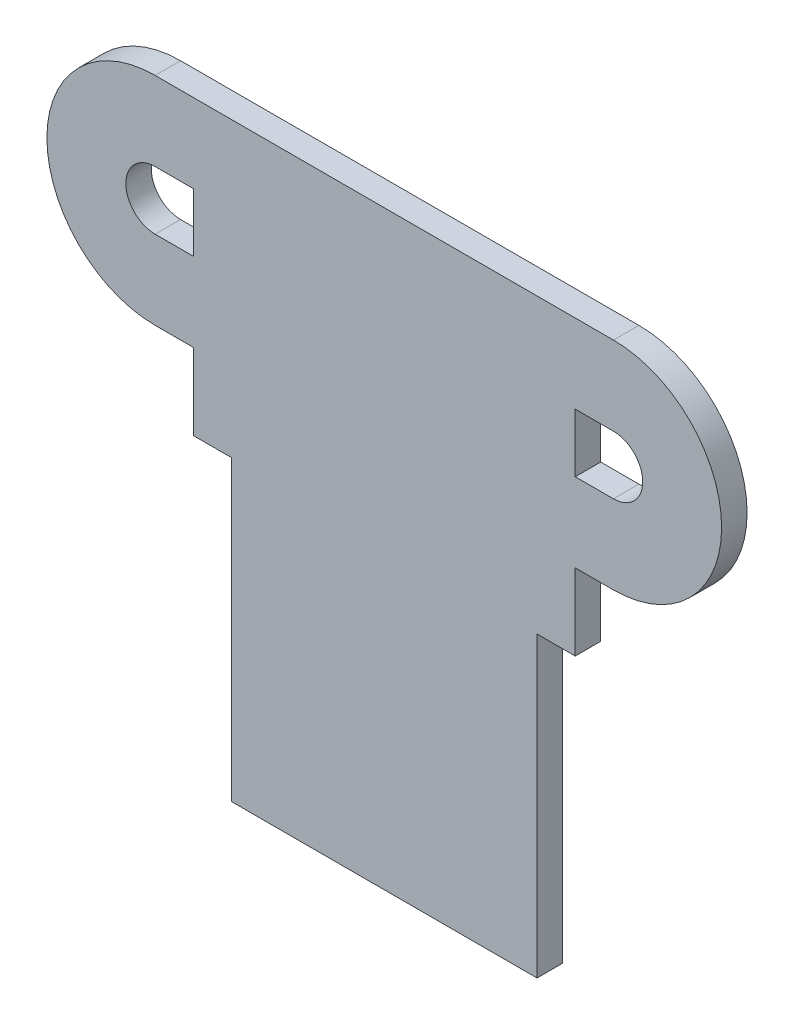
ISO-10303-21;
HEADER;
FILE_DESCRIPTION(('STEP AP214'),'2;1');
FILE_NAME('part.step','',(''),(''),'','','');
FILE_SCHEMA(('AUTOMOTIVE_DESIGN { 1 0 10303 214 1 1 1 1 }'));
ENDSEC;
DATA;
#1=APPLICATION_CONTEXT('core data for automotive mechanical design processes');
#2=APPLICATION_PROTOCOL_DEFINITION('international standard','automotive_design',2000,#1);
#3=PRODUCT_CONTEXT('',#1,'mechanical');
#4=PRODUCT('Part','Part','',(#3));
#5=PRODUCT_RELATED_PRODUCT_CATEGORY('part','',(#4));
#6=PRODUCT_DEFINITION_FORMATION('','',#4);
#7=PRODUCT_DEFINITION_CONTEXT('part definition',#1,'design');
#8=PRODUCT_DEFINITION('design','',#6,#7);
#9=PRODUCT_DEFINITION_SHAPE('','',#8);
#10=(LENGTH_UNIT() NAMED_UNIT(*) SI_UNIT(.MILLI.,.METRE.));
#11=(NAMED_UNIT(*) PLANE_ANGLE_UNIT() SI_UNIT($,.RADIAN.));
#12=(NAMED_UNIT(*) SI_UNIT($,.STERADIAN.) SOLID_ANGLE_UNIT());
#13=UNCERTAINTY_MEASURE_WITH_UNIT(LENGTH_MEASURE(1.E-05),#10,'distance_accuracy_value','');
#14=(GEOMETRIC_REPRESENTATION_CONTEXT(3) GLOBAL_UNCERTAINTY_ASSIGNED_CONTEXT((#13)) GLOBAL_UNIT_ASSIGNED_CONTEXT((#10,
#11,#12)) REPRESENTATION_CONTEXT('',''));
#15=CARTESIAN_POINT('',(0.,0.,0.));
#16=DIRECTION('',(0.,0.,1.));
#17=DIRECTION('',(1.,0.,0.));
#18=AXIS2_PLACEMENT_3D('',#15,#16,#17);
#19=CARTESIAN_POINT('',(-3.,18.95,1.));
#20=DIRECTION('',(0.,0.,1.));
#21=DIRECTION('',(1.,0.,0.));
#22=AXIS2_PLACEMENT_3D('',#19,#20,#21);
#23=PLANE('',#22);
#24=DIRECTION('',(-1.,0.,0.));
#25=VECTOR('',#24,1.);
#26=CARTESIAN_POINT('',(15.,20.1,1.));
#27=LINE('',#26,#25);
#28=CARTESIAN_POINT('',(15.,20.1,1.));
#29=VERTEX_POINT('',#28);
#30=CARTESIAN_POINT('',(13.5,20.1,1.));
#31=VERTEX_POINT('',#30);
#32=EDGE_CURVE('E206',#29,#31,#27,.T.);
#33=ORIENTED_EDGE('',*,*,#32,.F.);
#34=CARTESIAN_POINT('',(15.,18.95,1.));
#35=DIRECTION('',(0.,0.,1.));
#36=DIRECTION('',(-1.,0.,0.));
#37=AXIS2_PLACEMENT_3D('',#34,#35,#36);
#38=CIRCLE('',#37,1.15);
#39=CARTESIAN_POINT('',(15.,17.8,1.));
#40=VERTEX_POINT('',#39);
#41=EDGE_CURVE('E204',#40,#29,#38,.T.);
#42=ORIENTED_EDGE('',*,*,#41,.F.);
#43=DIRECTION('',(1.,0.,0.));
#44=VECTOR('',#43,1.);
#45=CARTESIAN_POINT('',(13.5,17.8,1.));
#46=LINE('',#45,#44);
#47=CARTESIAN_POINT('',(13.5,17.8,1.));
#48=VERTEX_POINT('',#47);
#49=EDGE_CURVE('E212',#48,#40,#46,.T.);
#50=ORIENTED_EDGE('',*,*,#49,.F.);
#51=DIRECTION('',(0.,-1.,0.));
#52=VECTOR('',#51,1.);
#53=CARTESIAN_POINT('',(13.5,20.1,1.));
#54=LINE('',#53,#52);
#55=EDGE_CURVE('E209',#31,#48,#54,.T.);
#56=ORIENTED_EDGE('',*,*,#55,.F.);
#57=EDGE_LOOP('',(#33,#42,#50,#56));
#58=FACE_BOUND('',#57,.T.);
#59=DIRECTION('',(0.,-1.,0.));
#60=VECTOR('',#59,1.);
#61=CARTESIAN_POINT('',(0.,0.,1.));
#62=LINE('',#61,#60);
#63=CARTESIAN_POINT('',(0.,11.7,1.));
#64=VERTEX_POINT('',#63);
#65=CARTESIAN_POINT('',(0.,0.,1.));
#66=VERTEX_POINT('',#65);
#67=EDGE_CURVE('E235',#64,#66,#62,.T.);
#68=ORIENTED_EDGE('',*,*,#67,.T.);
#69=DIRECTION('',(1.,0.,0.));
#70=VECTOR('',#69,1.);
#71=CARTESIAN_POINT('',(0.,0.,1.));
#72=LINE('',#71,#70);
#73=CARTESIAN_POINT('',(12.,0.,1.));
#74=VERTEX_POINT('',#73);
#75=EDGE_CURVE('E238',#66,#74,#72,.T.);
#76=ORIENTED_EDGE('',*,*,#75,.T.);
#77=DIRECTION('',(0.,1.,0.));
#78=VECTOR('',#77,1.);
#79=CARTESIAN_POINT('',(12.,0.,1.));
#80=LINE('',#79,#78);
#81=CARTESIAN_POINT('',(12.,11.7,1.));
#82=VERTEX_POINT('',#81);
#83=EDGE_CURVE('E241',#74,#82,#80,.T.);
#84=ORIENTED_EDGE('',*,*,#83,.T.);
#85=DIRECTION('',(1.,0.,0.));
#86=VECTOR('',#85,1.);
#87=CARTESIAN_POINT('',(12.,11.7,1.));
#88=LINE('',#87,#86);
#89=CARTESIAN_POINT('',(13.5,11.7,1.));
#90=VERTEX_POINT('',#89);
#91=EDGE_CURVE('E243',#82,#90,#88,.T.);
#92=ORIENTED_EDGE('',*,*,#91,.T.);
#93=DIRECTION('',(0.,1.,0.));
#94=VECTOR('',#93,1.);
#95=CARTESIAN_POINT('',(13.5,11.7,1.));
#96=LINE('',#95,#94);
#97=CARTESIAN_POINT('',(13.5,14.7,1.));
#98=VERTEX_POINT('',#97);
#99=EDGE_CURVE('E245',#90,#98,#96,.T.);
#100=ORIENTED_EDGE('',*,*,#99,.T.);
#101=DIRECTION('',(1.,0.,0.));
#102=VECTOR('',#101,1.);
#103=CARTESIAN_POINT('',(13.5,14.7,1.));
#104=LINE('',#103,#102);
#105=CARTESIAN_POINT('',(15.,14.7,1.));
#106=VERTEX_POINT('',#105);
#107=EDGE_CURVE('E247',#98,#106,#104,.T.);
#108=ORIENTED_EDGE('',*,*,#107,.T.);
#109=CARTESIAN_POINT('',(15.,18.95,1.));
#110=DIRECTION('',(0.,0.,1.));
#111=DIRECTION('',(-1.,0.,0.));
#112=AXIS2_PLACEMENT_3D('',#109,#110,#111);
#113=CIRCLE('',#112,4.25);
#114=CARTESIAN_POINT('',(15.,23.2,1.));
#115=VERTEX_POINT('',#114);
#116=EDGE_CURVE('E249',#106,#115,#113,.T.);
#117=ORIENTED_EDGE('',*,*,#116,.T.);
#118=DIRECTION('',(-1.,0.,0.));
#119=VECTOR('',#118,1.);
#120=CARTESIAN_POINT('',(-3.,23.2,1.));
#121=LINE('',#120,#119);
#122=CARTESIAN_POINT('',(-3.,23.2,1.));
#123=VERTEX_POINT('',#122);
#124=EDGE_CURVE('E251',#115,#123,#121,.T.);
#125=ORIENTED_EDGE('',*,*,#124,.T.);
#126=CARTESIAN_POINT('',(-3.,18.95,1.));
#127=DIRECTION('',(0.,0.,1.));
#128=DIRECTION('',(1.,0.,0.));
#129=AXIS2_PLACEMENT_3D('',#126,#127,#128);
#130=CIRCLE('',#129,4.25);
#131=CARTESIAN_POINT('',(-3.,14.7,1.));
#132=VERTEX_POINT('',#131);
#133=EDGE_CURVE('E253',#123,#132,#130,.T.);
#134=ORIENTED_EDGE('',*,*,#133,.T.);
#135=DIRECTION('',(1.,0.,0.));
#136=VECTOR('',#135,1.);
#137=CARTESIAN_POINT('',(-3.,14.7,1.));
#138=LINE('',#137,#136);
#139=CARTESIAN_POINT('',(-1.5,14.7,1.));
#140=VERTEX_POINT('',#139);
#141=EDGE_CURVE('E255',#132,#140,#138,.T.);
#142=ORIENTED_EDGE('',*,*,#141,.T.);
#143=DIRECTION('',(0.,-1.,0.));
#144=VECTOR('',#143,1.);
#145=CARTESIAN_POINT('',(-1.5,14.7,1.));
#146=LINE('',#145,#144);
#147=CARTESIAN_POINT('',(-1.5,11.7,1.));
#148=VERTEX_POINT('',#147);
#149=EDGE_CURVE('E257',#140,#148,#146,.T.);
#150=ORIENTED_EDGE('',*,*,#149,.T.);
#151=DIRECTION('',(1.,0.,0.));
#152=VECTOR('',#151,1.);
#153=CARTESIAN_POINT('',(-1.5,11.7,1.));
#154=LINE('',#153,#152);
#155=EDGE_CURVE('E259',#148,#64,#154,.T.);
#156=ORIENTED_EDGE('',*,*,#155,.T.);
#157=EDGE_LOOP('',(#68,#76,#84,#92,#100,#108,#117,#125,#134,#142,#150,#156));
#158=FACE_BOUND('',#157,.T.);
#159=DIRECTION('',(1.,0.,0.));
#160=VECTOR('',#159,1.);
#161=CARTESIAN_POINT('',(-1.5,17.8,1.));
#162=LINE('',#161,#160);
#163=CARTESIAN_POINT('',(-3.,17.8,1.));
#164=VERTEX_POINT('',#163);
#165=CARTESIAN_POINT('',(-1.5,17.8,1.));
#166=VERTEX_POINT('',#165);
#167=EDGE_CURVE('E176',#164,#166,#162,.T.);
#168=ORIENTED_EDGE('',*,*,#167,.F.);
#169=CARTESIAN_POINT('',(-3.,18.95,1.));
#170=DIRECTION('',(0.,0.,1.));
#171=DIRECTION('',(1.,0.,0.));
#172=AXIS2_PLACEMENT_3D('',#169,#170,#171);
#173=CIRCLE('',#172,1.15);
#174=CARTESIAN_POINT('',(-3.,20.1,1.));
#175=VERTEX_POINT('',#174);
#176=EDGE_CURVE('E168',#175,#164,#173,.T.);
#177=ORIENTED_EDGE('',*,*,#176,.F.);
#178=DIRECTION('',(-1.,0.,0.));
#179=VECTOR('',#178,1.);
#180=CARTESIAN_POINT('',(-3.,20.1,1.));
#181=LINE('',#180,#179);
#182=CARTESIAN_POINT('',(-1.5,20.1,1.));
#183=VERTEX_POINT('',#182);
#184=EDGE_CURVE('E190',#183,#175,#181,.T.);
#185=ORIENTED_EDGE('',*,*,#184,.F.);
#186=DIRECTION('',(0.,1.,0.));
#187=VECTOR('',#186,1.);
#188=CARTESIAN_POINT('',(-1.5,20.1,1.));
#189=LINE('',#188,#187);
#190=EDGE_CURVE('E188',#166,#183,#189,.T.);
#191=ORIENTED_EDGE('',*,*,#190,.F.);
#192=EDGE_LOOP('',(#168,#177,#185,#191));
#193=FACE_BOUND('',#192,.T.);
#194=ADVANCED_FACE('F31',(#58,#158,#193),#23,.T.);
#195=CARTESIAN_POINT('',(-3.,18.95,0.));
#196=DIRECTION('',(0.,0.,1.));
#197=DIRECTION('',(1.,0.,0.));
#198=AXIS2_PLACEMENT_3D('',#195,#196,#197);
#199=PLANE('',#198);
#200=CARTESIAN_POINT('',(15.,18.95,0.));
#201=DIRECTION('',(0.,0.,1.));
#202=DIRECTION('',(-1.,0.,0.));
#203=AXIS2_PLACEMENT_3D('',#200,#201,#202);
#204=CIRCLE('',#203,1.15);
#205=CARTESIAN_POINT('',(15.,17.8,0.));
#206=VERTEX_POINT('',#205);
#207=CARTESIAN_POINT('',(15.,20.1,0.));
#208=VERTEX_POINT('',#207);
#209=EDGE_CURVE('E184',#206,#208,#204,.T.);
#210=ORIENTED_EDGE('',*,*,#209,.T.);
#211=DIRECTION('',(-1.,0.,0.));
#212=VECTOR('',#211,1.);
#213=CARTESIAN_POINT('',(15.,20.1,0.));
#214=LINE('',#213,#212);
#215=CARTESIAN_POINT('',(13.5,20.1,0.));
#216=VERTEX_POINT('',#215);
#217=EDGE_CURVE('E217',#208,#216,#214,.T.);
#218=ORIENTED_EDGE('',*,*,#217,.T.);
#219=DIRECTION('',(0.,-1.,0.));
#220=VECTOR('',#219,1.);
#221=CARTESIAN_POINT('',(13.5,20.1,0.));
#222=LINE('',#221,#220);
#223=CARTESIAN_POINT('',(13.5,17.8,0.));
#224=VERTEX_POINT('',#223);
#225=EDGE_CURVE('E220',#216,#224,#222,.T.);
#226=ORIENTED_EDGE('',*,*,#225,.T.);
#227=DIRECTION('',(1.,0.,0.));
#228=VECTOR('',#227,1.);
#229=CARTESIAN_POINT('',(13.5,17.8,0.));
#230=LINE('',#229,#228);
#231=EDGE_CURVE('E207',#224,#206,#230,.T.);
#232=ORIENTED_EDGE('',*,*,#231,.T.);
#233=EDGE_LOOP('',(#210,#218,#226,#232));
#234=FACE_BOUND('',#233,.T.);
#235=DIRECTION('',(0.,-1.,0.));
#236=VECTOR('',#235,1.);
#237=CARTESIAN_POINT('',(0.,0.,0.));
#238=LINE('',#237,#236);
#239=CARTESIAN_POINT('',(0.,11.7,0.));
#240=VERTEX_POINT('',#239);
#241=CARTESIAN_POINT('',(0.,0.,0.));
#242=VERTEX_POINT('',#241);
#243=EDGE_CURVE('E234',#240,#242,#238,.T.);
#244=ORIENTED_EDGE('',*,*,#243,.F.);
#245=DIRECTION('',(1.,0.,0.));
#246=VECTOR('',#245,1.);
#247=CARTESIAN_POINT('',(-1.5,11.7,0.));
#248=LINE('',#247,#246);
#249=CARTESIAN_POINT('',(-1.5,11.7,0.));
#250=VERTEX_POINT('',#249);
#251=EDGE_CURVE('E239',#250,#240,#248,.T.);
#252=ORIENTED_EDGE('',*,*,#251,.F.);
#253=DIRECTION('',(0.,-1.,0.));
#254=VECTOR('',#253,1.);
#255=CARTESIAN_POINT('',(-1.5,14.7,0.));
#256=LINE('',#255,#254);
#257=CARTESIAN_POINT('',(-1.5,14.7,0.));
#258=VERTEX_POINT('',#257);
#259=EDGE_CURVE('E282',#258,#250,#256,.T.);
#260=ORIENTED_EDGE('',*,*,#259,.F.);
#261=DIRECTION('',(1.,0.,0.));
#262=VECTOR('',#261,1.);
#263=CARTESIAN_POINT('',(-3.,14.7,0.));
#264=LINE('',#263,#262);
#265=CARTESIAN_POINT('',(-3.,14.7,0.));
#266=VERTEX_POINT('',#265);
#267=EDGE_CURVE('E280',#266,#258,#264,.T.);
#268=ORIENTED_EDGE('',*,*,#267,.F.);
#269=CARTESIAN_POINT('',(-3.,18.95,0.));
#270=DIRECTION('',(0.,0.,1.));
#271=DIRECTION('',(1.,0.,0.));
#272=AXIS2_PLACEMENT_3D('',#269,#270,#271);
#273=CIRCLE('',#272,4.25);
#274=CARTESIAN_POINT('',(-3.,23.2,0.));
#275=VERTEX_POINT('',#274);
#276=EDGE_CURVE('E278',#275,#266,#273,.T.);
#277=ORIENTED_EDGE('',*,*,#276,.F.);
#278=DIRECTION('',(-1.,0.,0.));
#279=VECTOR('',#278,1.);
#280=CARTESIAN_POINT('',(-3.,23.2,0.));
#281=LINE('',#280,#279);
#282=CARTESIAN_POINT('',(15.,23.2,0.));
#283=VERTEX_POINT('',#282);
#284=EDGE_CURVE('E276',#283,#275,#281,.T.);
#285=ORIENTED_EDGE('',*,*,#284,.F.);
#286=CARTESIAN_POINT('',(15.,18.95,0.));
#287=DIRECTION('',(0.,0.,1.));
#288=DIRECTION('',(-1.,0.,0.));
#289=AXIS2_PLACEMENT_3D('',#286,#287,#288);
#290=CIRCLE('',#289,4.25);
#291=CARTESIAN_POINT('',(15.,14.7,0.));
#292=VERTEX_POINT('',#291);
#293=EDGE_CURVE('E274',#292,#283,#290,.T.);
#294=ORIENTED_EDGE('',*,*,#293,.F.);
#295=DIRECTION('',(1.,0.,0.));
#296=VECTOR('',#295,1.);
#297=CARTESIAN_POINT('',(13.5,14.7,0.));
#298=LINE('',#297,#296);
#299=CARTESIAN_POINT('',(13.5,14.7,0.));
#300=VERTEX_POINT('',#299);
#301=EDGE_CURVE('E272',#300,#292,#298,.T.);
#302=ORIENTED_EDGE('',*,*,#301,.F.);
#303=DIRECTION('',(0.,1.,0.));
#304=VECTOR('',#303,1.);
#305=CARTESIAN_POINT('',(13.5,11.7,0.));
#306=LINE('',#305,#304);
#307=CARTESIAN_POINT('',(13.5,11.7,0.));
#308=VERTEX_POINT('',#307);
#309=EDGE_CURVE('E270',#308,#300,#306,.T.);
#310=ORIENTED_EDGE('',*,*,#309,.F.);
#311=DIRECTION('',(1.,0.,0.));
#312=VECTOR('',#311,1.);
#313=CARTESIAN_POINT('',(12.,11.7,0.));
#314=LINE('',#313,#312);
#315=CARTESIAN_POINT('',(12.,11.7,0.));
#316=VERTEX_POINT('',#315);
#317=EDGE_CURVE('E268',#316,#308,#314,.T.);
#318=ORIENTED_EDGE('',*,*,#317,.F.);
#319=DIRECTION('',(0.,1.,0.));
#320=VECTOR('',#319,1.);
#321=CARTESIAN_POINT('',(12.,0.,0.));
#322=LINE('',#321,#320);
#323=CARTESIAN_POINT('',(12.,0.,0.));
#324=VERTEX_POINT('',#323);
#325=EDGE_CURVE('E266',#324,#316,#322,.T.);
#326=ORIENTED_EDGE('',*,*,#325,.F.);
#327=DIRECTION('',(1.,0.,0.));
#328=VECTOR('',#327,1.);
#329=CARTESIAN_POINT('',(0.,0.,0.));
#330=LINE('',#329,#328);
#331=EDGE_CURVE('E264',#242,#324,#330,.T.);
#332=ORIENTED_EDGE('',*,*,#331,.F.);
#333=EDGE_LOOP('',(#244,#252,#260,#268,#277,#285,#294,#302,#310,#318,#326,#332));
#334=FACE_BOUND('',#333,.T.);
#335=CARTESIAN_POINT('',(-3.,18.95,0.));
#336=DIRECTION('',(0.,0.,1.));
#337=DIRECTION('',(1.,0.,0.));
#338=AXIS2_PLACEMENT_3D('',#335,#336,#337);
#339=CIRCLE('',#338,1.15);
#340=CARTESIAN_POINT('',(-3.,20.1,0.));
#341=VERTEX_POINT('',#340);
#342=CARTESIAN_POINT('',(-3.,17.8,0.));
#343=VERTEX_POINT('',#342);
#344=EDGE_CURVE('E54',#341,#343,#339,.T.);
#345=ORIENTED_EDGE('',*,*,#344,.T.);
#346=DIRECTION('',(1.,0.,0.));
#347=VECTOR('',#346,1.);
#348=CARTESIAN_POINT('',(-1.5,17.8,0.));
#349=LINE('',#348,#347);
#350=CARTESIAN_POINT('',(-1.5,17.8,0.));
#351=VERTEX_POINT('',#350);
#352=EDGE_CURVE('E183',#343,#351,#349,.T.);
#353=ORIENTED_EDGE('',*,*,#352,.T.);
#354=DIRECTION('',(0.,1.,0.));
#355=VECTOR('',#354,1.);
#356=CARTESIAN_POINT('',(-1.5,20.1,0.));
#357=LINE('',#356,#355);
#358=CARTESIAN_POINT('',(-1.5,20.1,0.));
#359=VERTEX_POINT('',#358);
#360=EDGE_CURVE('E196',#351,#359,#357,.T.);
#361=ORIENTED_EDGE('',*,*,#360,.T.);
#362=DIRECTION('',(-1.,0.,0.));
#363=VECTOR('',#362,1.);
#364=CARTESIAN_POINT('',(-3.,20.1,0.));
#365=LINE('',#364,#363);
#366=EDGE_CURVE('E177',#359,#341,#365,.T.);
#367=ORIENTED_EDGE('',*,*,#366,.T.);
#368=EDGE_LOOP('',(#345,#353,#361,#367));
#369=FACE_BOUND('',#368,.T.);
#370=ADVANCED_FACE('F324',(#234,#334,#369),#199,.F.);
#371=CARTESIAN_POINT('',(0.,0.,1.));
#372=DIRECTION('',(1.,0.,0.));
#373=DIRECTION('',(0.,0.,-1.));
#374=AXIS2_PLACEMENT_3D('',#371,#372,#373);
#375=PLANE('',#374);
#376=ORIENTED_EDGE('',*,*,#243,.T.);
#377=DIRECTION('',(0.,0.,-1.));
#378=VECTOR('',#377,1.);
#379=CARTESIAN_POINT('',(0.,0.,1.));
#380=LINE('',#379,#378);
#381=EDGE_CURVE('E11',#66,#242,#380,.T.);
#382=ORIENTED_EDGE('',*,*,#381,.F.);
#383=ORIENTED_EDGE('',*,*,#67,.F.);
#384=DIRECTION('',(0.,0.,-1.));
#385=VECTOR('',#384,1.);
#386=CARTESIAN_POINT('',(0.,11.7,1.));
#387=LINE('',#386,#385);
#388=EDGE_CURVE('E261',#64,#240,#387,.T.);
#389=ORIENTED_EDGE('',*,*,#388,.T.);
#390=EDGE_LOOP('',(#376,#382,#383,#389));
#391=FACE_BOUND('',#390,.T.);
#392=ADVANCED_FACE('F33',(#391),#375,.F.);
#393=CARTESIAN_POINT('',(0.,0.,1.));
#394=DIRECTION('',(0.,1.,0.));
#395=DIRECTION('',(0.,0.,1.));
#396=AXIS2_PLACEMENT_3D('',#393,#394,#395);
#397=PLANE('',#396);
#398=ORIENTED_EDGE('',*,*,#331,.T.);
#399=DIRECTION('',(0.,0.,-1.));
#400=VECTOR('',#399,1.);
#401=CARTESIAN_POINT('',(12.,0.,1.));
#402=LINE('',#401,#400);
#403=EDGE_CURVE('E39',#74,#324,#402,.T.);
#404=ORIENTED_EDGE('',*,*,#403,.F.);
#405=ORIENTED_EDGE('',*,*,#75,.F.);
#406=ORIENTED_EDGE('',*,*,#381,.T.);
#407=EDGE_LOOP('',(#398,#404,#405,#406));
#408=FACE_BOUND('',#407,.T.);
#409=ADVANCED_FACE('F341',(#408),#397,.F.);
#410=CARTESIAN_POINT('',(12.,0.,1.));
#411=DIRECTION('',(-1.,0.,0.));
#412=DIRECTION('',(0.,0.,1.));
#413=AXIS2_PLACEMENT_3D('',#410,#411,#412);
#414=PLANE('',#413);
#415=ORIENTED_EDGE('',*,*,#325,.T.);
#416=DIRECTION('',(0.,0.,-1.));
#417=VECTOR('',#416,1.);
#418=CARTESIAN_POINT('',(12.,11.7,1.));
#419=LINE('',#418,#417);
#420=EDGE_CURVE('E311',#82,#316,#419,.T.);
#421=ORIENTED_EDGE('',*,*,#420,.F.);
#422=ORIENTED_EDGE('',*,*,#83,.F.);
#423=ORIENTED_EDGE('',*,*,#403,.T.);
#424=EDGE_LOOP('',(#415,#421,#422,#423));
#425=FACE_BOUND('',#424,.T.);
#426=ADVANCED_FACE('F318',(#425),#414,.F.);
#427=CARTESIAN_POINT('',(12.,11.7,1.));
#428=DIRECTION('',(0.,1.,0.));
#429=DIRECTION('',(0.,0.,1.));
#430=AXIS2_PLACEMENT_3D('',#427,#428,#429);
#431=PLANE('',#430);
#432=ORIENTED_EDGE('',*,*,#317,.T.);
#433=DIRECTION('',(0.,0.,-1.));
#434=VECTOR('',#433,1.);
#435=CARTESIAN_POINT('',(13.5,11.7,1.));
#436=LINE('',#435,#434);
#437=EDGE_CURVE('E308',#90,#308,#436,.T.);
#438=ORIENTED_EDGE('',*,*,#437,.F.);
#439=ORIENTED_EDGE('',*,*,#91,.F.);
#440=ORIENTED_EDGE('',*,*,#420,.T.);
#441=EDGE_LOOP('',(#432,#438,#439,#440));
#442=FACE_BOUND('',#441,.T.);
#443=ADVANCED_FACE('F330',(#442),#431,.F.);
#444=CARTESIAN_POINT('',(13.5,11.7,1.));
#445=DIRECTION('',(-1.,0.,0.));
#446=DIRECTION('',(0.,-1.,0.));
#447=AXIS2_PLACEMENT_3D('',#444,#445,#446);
#448=PLANE('',#447);
#449=ORIENTED_EDGE('',*,*,#309,.T.);
#450=DIRECTION('',(0.,0.,-1.));
#451=VECTOR('',#450,1.);
#452=CARTESIAN_POINT('',(13.5,14.7,1.));
#453=LINE('',#452,#451);
#454=EDGE_CURVE('E305',#98,#300,#453,.T.);
#455=ORIENTED_EDGE('',*,*,#454,.F.);
#456=ORIENTED_EDGE('',*,*,#99,.F.);
#457=ORIENTED_EDGE('',*,*,#437,.T.);
#458=EDGE_LOOP('',(#449,#455,#456,#457));
#459=FACE_BOUND('',#458,.T.);
#460=ADVANCED_FACE('F334',(#459),#448,.F.);
#461=CARTESIAN_POINT('',(13.5,14.7,1.));
#462=DIRECTION('',(0.,1.,0.));
#463=DIRECTION('',(0.,0.,1.));
#464=AXIS2_PLACEMENT_3D('',#461,#462,#463);
#465=PLANE('',#464);
#466=ORIENTED_EDGE('',*,*,#301,.T.);
#467=DIRECTION('',(0.,0.,-1.));
#468=VECTOR('',#467,1.);
#469=CARTESIAN_POINT('',(15.,14.7,1.));
#470=LINE('',#469,#468);
#471=EDGE_CURVE('E302',#106,#292,#470,.T.);
#472=ORIENTED_EDGE('',*,*,#471,.F.);
#473=ORIENTED_EDGE('',*,*,#107,.F.);
#474=ORIENTED_EDGE('',*,*,#454,.T.);
#475=EDGE_LOOP('',(#466,#472,#473,#474));
#476=FACE_BOUND('',#475,.T.);
#477=ADVANCED_FACE('F374',(#476),#465,.F.);
#478=CARTESIAN_POINT('',(15.,18.95,1.));
#479=DIRECTION('',(0.,0.,-1.));
#480=DIRECTION('',(-1.,0.,0.));
#481=AXIS2_PLACEMENT_3D('',#478,#479,#480);
#482=CYLINDRICAL_SURFACE('',#481,4.25);
#483=ORIENTED_EDGE('',*,*,#293,.T.);
#484=DIRECTION('',(0.,0.,-1.));
#485=VECTOR('',#484,1.);
#486=CARTESIAN_POINT('',(15.,23.2,1.));
#487=LINE('',#486,#485);
#488=EDGE_CURVE('E299',#115,#283,#487,.T.);
#489=ORIENTED_EDGE('',*,*,#488,.F.);
#490=ORIENTED_EDGE('',*,*,#116,.F.);
#491=ORIENTED_EDGE('',*,*,#471,.T.);
#492=EDGE_LOOP('',(#483,#489,#490,#491));
#493=FACE_BOUND('',#492,.T.);
#494=ADVANCED_FACE('F372',(#493),#482,.T.);
#495=CARTESIAN_POINT('',(-3.,23.2,1.));
#496=DIRECTION('',(0.,-1.,0.));
#497=DIRECTION('',(0.,0.,-1.));
#498=AXIS2_PLACEMENT_3D('',#495,#496,#497);
#499=PLANE('',#498);
#500=ORIENTED_EDGE('',*,*,#284,.T.);
#501=DIRECTION('',(0.,0.,-1.));
#502=VECTOR('',#501,1.);
#503=CARTESIAN_POINT('',(-3.,23.2,1.));
#504=LINE('',#503,#502);
#505=EDGE_CURVE('E296',#123,#275,#504,.T.);
#506=ORIENTED_EDGE('',*,*,#505,.F.);
#507=ORIENTED_EDGE('',*,*,#124,.F.);
#508=ORIENTED_EDGE('',*,*,#488,.T.);
#509=EDGE_LOOP('',(#500,#506,#507,#508));
#510=FACE_BOUND('',#509,.T.);
#511=ADVANCED_FACE('F368',(#510),#499,.F.);
#512=CARTESIAN_POINT('',(-3.,18.95,1.));
#513=DIRECTION('',(0.,0.,-1.));
#514=DIRECTION('',(-1.,0.,0.));
#515=AXIS2_PLACEMENT_3D('',#512,#513,#514);
#516=CYLINDRICAL_SURFACE('',#515,4.25);
#517=ORIENTED_EDGE('',*,*,#276,.T.);
#518=DIRECTION('',(0.,0.,-1.));
#519=VECTOR('',#518,1.);
#520=CARTESIAN_POINT('',(-3.,14.7,1.));
#521=LINE('',#520,#519);
#522=EDGE_CURVE('E293',#132,#266,#521,.T.);
#523=ORIENTED_EDGE('',*,*,#522,.F.);
#524=ORIENTED_EDGE('',*,*,#133,.F.);
#525=ORIENTED_EDGE('',*,*,#505,.T.);
#526=EDGE_LOOP('',(#517,#523,#524,#525));
#527=FACE_BOUND('',#526,.T.);
#528=ADVANCED_FACE('F363',(#527),#516,.T.);
#529=CARTESIAN_POINT('',(-3.,14.7,1.));
#530=DIRECTION('',(0.,1.,0.));
#531=DIRECTION('',(0.,0.,1.));
#532=AXIS2_PLACEMENT_3D('',#529,#530,#531);
#533=PLANE('',#532);
#534=ORIENTED_EDGE('',*,*,#267,.T.);
#535=DIRECTION('',(0.,0.,-1.));
#536=VECTOR('',#535,1.);
#537=CARTESIAN_POINT('',(-1.5,14.7,1.));
#538=LINE('',#537,#536);
#539=EDGE_CURVE('E290',#140,#258,#538,.T.);
#540=ORIENTED_EDGE('',*,*,#539,.F.);
#541=ORIENTED_EDGE('',*,*,#141,.F.);
#542=ORIENTED_EDGE('',*,*,#522,.T.);
#543=EDGE_LOOP('',(#534,#540,#541,#542));
#544=FACE_BOUND('',#543,.T.);
#545=ADVANCED_FACE('F357',(#544),#533,.F.);
#546=CARTESIAN_POINT('',(-1.5,14.7,1.));
#547=DIRECTION('',(1.,0.,0.));
#548=DIRECTION('',(0.,0.,-1.));
#549=AXIS2_PLACEMENT_3D('',#546,#547,#548);
#550=PLANE('',#549);
#551=ORIENTED_EDGE('',*,*,#259,.T.);
#552=DIRECTION('',(0.,0.,-1.));
#553=VECTOR('',#552,1.);
#554=CARTESIAN_POINT('',(-1.5,11.7,1.));
#555=LINE('',#554,#553);
#556=EDGE_CURVE('E287',#148,#250,#555,.T.);
#557=ORIENTED_EDGE('',*,*,#556,.F.);
#558=ORIENTED_EDGE('',*,*,#149,.F.);
#559=ORIENTED_EDGE('',*,*,#539,.T.);
#560=EDGE_LOOP('',(#551,#557,#558,#559));
#561=FACE_BOUND('',#560,.T.);
#562=ADVANCED_FACE('F353',(#561),#550,.F.);
#563=CARTESIAN_POINT('',(-1.5,11.7,1.));
#564=DIRECTION('',(0.,1.,0.));
#565=DIRECTION('',(0.,0.,1.));
#566=AXIS2_PLACEMENT_3D('',#563,#564,#565);
#567=PLANE('',#566);
#568=ORIENTED_EDGE('',*,*,#251,.T.);
#569=ORIENTED_EDGE('',*,*,#388,.F.);
#570=ORIENTED_EDGE('',*,*,#155,.F.);
#571=ORIENTED_EDGE('',*,*,#556,.T.);
#572=EDGE_LOOP('',(#568,#569,#570,#571));
#573=FACE_BOUND('',#572,.T.);
#574=ADVANCED_FACE('F348',(#573),#567,.F.);
#575=CARTESIAN_POINT('',(15.,18.95,1.));
#576=DIRECTION('',(0.,0.,-1.));
#577=DIRECTION('',(-1.,0.,0.));
#578=AXIS2_PLACEMENT_3D('',#575,#576,#577);
#579=CYLINDRICAL_SURFACE('',#578,1.15);
#580=ORIENTED_EDGE('',*,*,#209,.F.);
#581=DIRECTION('',(0.,0.,-1.));
#582=VECTOR('',#581,1.);
#583=CARTESIAN_POINT('',(15.,17.8,1.));
#584=LINE('',#583,#582);
#585=EDGE_CURVE('E214',#40,#206,#584,.T.);
#586=ORIENTED_EDGE('',*,*,#585,.F.);
#587=ORIENTED_EDGE('',*,*,#41,.T.);
#588=DIRECTION('',(0.,0.,-1.));
#589=VECTOR('',#588,1.);
#590=CARTESIAN_POINT('',(15.,20.1,1.));
#591=LINE('',#590,#589);
#592=EDGE_CURVE('E231',#29,#208,#591,.T.);
#593=ORIENTED_EDGE('',*,*,#592,.T.);
#594=EDGE_LOOP('',(#580,#586,#587,#593));
#595=FACE_BOUND('',#594,.T.);
#596=ADVANCED_FACE('F393',(#595),#579,.F.);
#597=CARTESIAN_POINT('',(15.,20.1,1.));
#598=DIRECTION('',(0.,-1.,0.));
#599=DIRECTION('',(0.,0.,-1.));
#600=AXIS2_PLACEMENT_3D('',#597,#598,#599);
#601=PLANE('',#600);
#602=ORIENTED_EDGE('',*,*,#217,.F.);
#603=ORIENTED_EDGE('',*,*,#592,.F.);
#604=ORIENTED_EDGE('',*,*,#32,.T.);
#605=DIRECTION('',(0.,0.,-1.));
#606=VECTOR('',#605,1.);
#607=CARTESIAN_POINT('',(13.5,20.1,1.));
#608=LINE('',#607,#606);
#609=EDGE_CURVE('E229',#31,#216,#608,.T.);
#610=ORIENTED_EDGE('',*,*,#609,.T.);
#611=EDGE_LOOP('',(#602,#603,#604,#610));
#612=FACE_BOUND('',#611,.T.);
#613=ADVANCED_FACE('F431',(#612),#601,.T.);
#614=CARTESIAN_POINT('',(13.5,20.1,1.));
#615=DIRECTION('',(1.,0.,0.));
#616=DIRECTION('',(0.,0.,-1.));
#617=AXIS2_PLACEMENT_3D('',#614,#615,#616);
#618=PLANE('',#617);
#619=ORIENTED_EDGE('',*,*,#225,.F.);
#620=ORIENTED_EDGE('',*,*,#609,.F.);
#621=ORIENTED_EDGE('',*,*,#55,.T.);
#622=DIRECTION('',(0.,0.,-1.));
#623=VECTOR('',#622,1.);
#624=CARTESIAN_POINT('',(13.5,17.8,1.));
#625=LINE('',#624,#623);
#626=EDGE_CURVE('E227',#48,#224,#625,.T.);
#627=ORIENTED_EDGE('',*,*,#626,.T.);
#628=EDGE_LOOP('',(#619,#620,#621,#627));
#629=FACE_BOUND('',#628,.T.);
#630=ADVANCED_FACE('F438',(#629),#618,.T.);
#631=CARTESIAN_POINT('',(13.5,17.8,1.));
#632=DIRECTION('',(0.,1.,0.));
#633=DIRECTION('',(0.,0.,1.));
#634=AXIS2_PLACEMENT_3D('',#631,#632,#633);
#635=PLANE('',#634);
#636=ORIENTED_EDGE('',*,*,#231,.F.);
#637=ORIENTED_EDGE('',*,*,#626,.F.);
#638=ORIENTED_EDGE('',*,*,#49,.T.);
#639=ORIENTED_EDGE('',*,*,#585,.T.);
#640=EDGE_LOOP('',(#636,#637,#638,#639));
#641=FACE_BOUND('',#640,.T.);
#642=ADVANCED_FACE('F445',(#641),#635,.T.);
#643=CARTESIAN_POINT('',(-3.,18.95,1.));
#644=DIRECTION('',(0.,0.,-1.));
#645=DIRECTION('',(-1.,0.,0.));
#646=AXIS2_PLACEMENT_3D('',#643,#644,#645);
#647=CYLINDRICAL_SURFACE('',#646,1.15);
#648=ORIENTED_EDGE('',*,*,#344,.F.);
#649=DIRECTION('',(0.,0.,-1.));
#650=VECTOR('',#649,1.);
#651=CARTESIAN_POINT('',(-3.,20.1,1.));
#652=LINE('',#651,#650);
#653=EDGE_CURVE('E172',#175,#341,#652,.T.);
#654=ORIENTED_EDGE('',*,*,#653,.F.);
#655=ORIENTED_EDGE('',*,*,#176,.T.);
#656=DIRECTION('',(0.,0.,-1.));
#657=VECTOR('',#656,1.);
#658=CARTESIAN_POINT('',(-3.,17.8,1.));
#659=LINE('',#658,#657);
#660=EDGE_CURVE('E171',#164,#343,#659,.T.);
#661=ORIENTED_EDGE('',*,*,#660,.T.);
#662=EDGE_LOOP('',(#648,#654,#655,#661));
#663=FACE_BOUND('',#662,.T.);
#664=ADVANCED_FACE('F170',(#663),#647,.F.);
#665=CARTESIAN_POINT('',(-1.5,17.8,1.));
#666=DIRECTION('',(0.,1.,0.));
#667=DIRECTION('',(0.,0.,1.));
#668=AXIS2_PLACEMENT_3D('',#665,#666,#667);
#669=PLANE('',#668);
#670=ORIENTED_EDGE('',*,*,#352,.F.);
#671=ORIENTED_EDGE('',*,*,#660,.F.);
#672=ORIENTED_EDGE('',*,*,#167,.T.);
#673=DIRECTION('',(0.,0.,-1.));
#674=VECTOR('',#673,1.);
#675=CARTESIAN_POINT('',(-1.5,17.8,1.));
#676=LINE('',#675,#674);
#677=EDGE_CURVE('E185',#166,#351,#676,.T.);
#678=ORIENTED_EDGE('',*,*,#677,.T.);
#679=EDGE_LOOP('',(#670,#671,#672,#678));
#680=FACE_BOUND('',#679,.T.);
#681=ADVANCED_FACE('F180',(#680),#669,.T.);
#682=CARTESIAN_POINT('',(-1.5,20.1,1.));
#683=DIRECTION('',(-1.,0.,0.));
#684=DIRECTION('',(0.,0.,1.));
#685=AXIS2_PLACEMENT_3D('',#682,#683,#684);
#686=PLANE('',#685);
#687=ORIENTED_EDGE('',*,*,#360,.F.);
#688=ORIENTED_EDGE('',*,*,#677,.F.);
#689=ORIENTED_EDGE('',*,*,#190,.T.);
#690=DIRECTION('',(0.,0.,-1.));
#691=VECTOR('',#690,1.);
#692=CARTESIAN_POINT('',(-1.5,20.1,1.));
#693=LINE('',#692,#691);
#694=EDGE_CURVE('E46',#183,#359,#693,.T.);
#695=ORIENTED_EDGE('',*,*,#694,.T.);
#696=EDGE_LOOP('',(#687,#688,#689,#695));
#697=FACE_BOUND('',#696,.T.);
#698=ADVANCED_FACE('F466',(#697),#686,.T.);
#699=CARTESIAN_POINT('',(-3.,20.1,1.));
#700=DIRECTION('',(0.,-1.,0.));
#701=DIRECTION('',(0.,0.,-1.));
#702=AXIS2_PLACEMENT_3D('',#699,#700,#701);
#703=PLANE('',#702);
#704=ORIENTED_EDGE('',*,*,#366,.F.);
#705=ORIENTED_EDGE('',*,*,#694,.F.);
#706=ORIENTED_EDGE('',*,*,#184,.T.);
#707=ORIENTED_EDGE('',*,*,#653,.T.);
#708=EDGE_LOOP('',(#704,#705,#706,#707));
#709=FACE_BOUND('',#708,.T.);
#710=ADVANCED_FACE('F473',(#709),#703,.T.);
#711=CLOSED_SHELL('',(#194,#370,#392,#409,#426,#443,#460,#477,#494,#511,#528,#545,#562,#574,
#596,#613,#630,#642,#664,#681,#698,#710));
#712=MANIFOLD_SOLID_BREP('B2',#711);
#713=ADVANCED_BREP_SHAPE_REPRESENTATION('',(#18,#712),#14);
#714=SHAPE_DEFINITION_REPRESENTATION(#9,#713);
ENDSEC;
END-ISO-10303-21;
